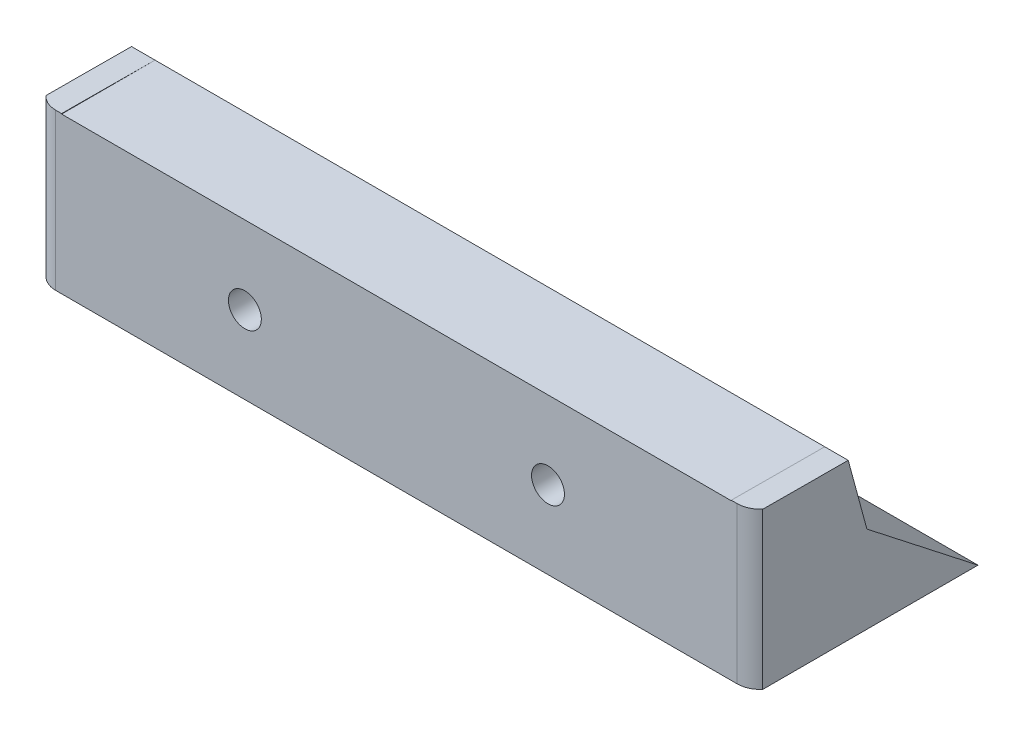
ISO-10303-21;
HEADER;
FILE_DESCRIPTION(('STEP AP214'),'2;1');
FILE_NAME('part.step','',(''),(''),'','','');
FILE_SCHEMA(('AUTOMOTIVE_DESIGN { 1 0 10303 214 1 1 1 1 }'));
ENDSEC;
DATA;
#1=APPLICATION_CONTEXT('core data for automotive mechanical design processes');
#2=APPLICATION_PROTOCOL_DEFINITION('international standard','automotive_design',2000,#1);
#3=PRODUCT_CONTEXT('',#1,'mechanical');
#4=PRODUCT('Part','Part','',(#3));
#5=PRODUCT_RELATED_PRODUCT_CATEGORY('part','',(#4));
#6=PRODUCT_DEFINITION_FORMATION('','',#4);
#7=PRODUCT_DEFINITION_CONTEXT('part definition',#1,'design');
#8=PRODUCT_DEFINITION('design','',#6,#7);
#9=PRODUCT_DEFINITION_SHAPE('','',#8);
#10=(LENGTH_UNIT() NAMED_UNIT(*) SI_UNIT(.MILLI.,.METRE.));
#11=(NAMED_UNIT(*) PLANE_ANGLE_UNIT() SI_UNIT($,.RADIAN.));
#12=(NAMED_UNIT(*) SI_UNIT($,.STERADIAN.) SOLID_ANGLE_UNIT());
#13=UNCERTAINTY_MEASURE_WITH_UNIT(LENGTH_MEASURE(1.E-05),#10,'distance_accuracy_value','');
#14=(GEOMETRIC_REPRESENTATION_CONTEXT(3) GLOBAL_UNCERTAINTY_ASSIGNED_CONTEXT((#13)) GLOBAL_UNIT_ASSIGNED_CONTEXT((#10,
#11,#12)) REPRESENTATION_CONTEXT('',''));
#15=CARTESIAN_POINT('',(0.,0.,0.));
#16=DIRECTION('',(0.,0.,1.));
#17=DIRECTION('',(1.,0.,0.));
#18=AXIS2_PLACEMENT_3D('',#15,#16,#17);
#19=CARTESIAN_POINT('',(31.,-21.,1.45));
#20=DIRECTION('',(0.,1.,0.));
#21=DIRECTION('',(0.,0.,1.));
#22=AXIS2_PLACEMENT_3D('',#19,#20,#21);
#23=PLANE('',#22);
#24=DIRECTION('',(0.,0.,-1.));
#25=VECTOR('',#24,1.);
#26=CARTESIAN_POINT('',(30.5,-21.,21.55));
#27=LINE('',#26,#25);
#28=CARTESIAN_POINT('',(30.5,-21.,0.772875655532291));
#29=VERTEX_POINT('',#28);
#30=CARTESIAN_POINT('',(30.5,-21.,-17.55));
#31=VERTEX_POINT('',#30);
#32=EDGE_CURVE('E111',#29,#31,#27,.T.);
#33=ORIENTED_EDGE('',*,*,#32,.F.);
#34=CARTESIAN_POINT('',(29.,-21.,-0.550000000000002));
#35=DIRECTION('',(0.,1.,0.));
#36=DIRECTION('',(0.,0.,1.));
#37=AXIS2_PLACEMENT_3D('',#34,#35,#36);
#38=CIRCLE('',#37,2.);
#39=CARTESIAN_POINT('',(29.,-21.,1.45));
#40=VERTEX_POINT('',#39);
#41=EDGE_CURVE('E121',#29,#40,#38,.F.);
#42=ORIENTED_EDGE('',*,*,#41,.T.);
#43=DIRECTION('',(-1.,0.,0.));
#44=VECTOR('',#43,1.);
#45=CARTESIAN_POINT('',(31.,-21.,1.45));
#46=LINE('',#45,#44);
#47=CARTESIAN_POINT('',(-29.,-21.,1.45));
#48=VERTEX_POINT('',#47);
#49=EDGE_CURVE('E153',#40,#48,#46,.T.);
#50=ORIENTED_EDGE('',*,*,#49,.T.);
#51=CARTESIAN_POINT('',(-29.,-21.,-0.550000000000002));
#52=DIRECTION('',(0.,1.,0.));
#53=DIRECTION('',(0.,0.,1.));
#54=AXIS2_PLACEMENT_3D('',#51,#52,#53);
#55=CIRCLE('',#54,2.);
#56=CARTESIAN_POINT('',(-30.5,-21.,0.772875655532284));
#57=VERTEX_POINT('',#56);
#58=EDGE_CURVE('E128',#48,#57,#55,.F.);
#59=ORIENTED_EDGE('',*,*,#58,.T.);
#60=DIRECTION('',(0.,0.,1.));
#61=VECTOR('',#60,1.);
#62=CARTESIAN_POINT('',(-30.5,-21.,21.55));
#63=LINE('',#62,#61);
#64=CARTESIAN_POINT('',(-30.5,-21.,-17.55));
#65=VERTEX_POINT('',#64);
#66=EDGE_CURVE('E51',#65,#57,#63,.T.);
#67=ORIENTED_EDGE('',*,*,#66,.F.);
#68=DIRECTION('',(-1.,0.,0.));
#69=VECTOR('',#68,1.);
#70=CARTESIAN_POINT('',(31.,-21.,-17.55));
#71=LINE('',#70,#69);
#72=EDGE_CURVE('E124',#31,#65,#71,.T.);
#73=ORIENTED_EDGE('',*,*,#72,.F.);
#74=EDGE_LOOP('',(#33,#42,#50,#59,#67,#73));
#75=FACE_BOUND('',#74,.T.);
#76=ADVANCED_FACE('F36',(#75),#23,.F.);
#77=CARTESIAN_POINT('',(31.,-21.,-17.55));
#78=DIRECTION('',(0.,-0.788010753606726,0.615661475325653));
#79=DIRECTION('',(0.,-0.615661475325653,-0.788010753606726));
#80=AXIS2_PLACEMENT_3D('',#77,#78,#79);
#81=PLANE('',#80);
#82=DIRECTION('',(0.,0.615661475325653,0.788010753606726));
#83=VECTOR('',#82,1.);
#84=CARTESIAN_POINT('',(30.5,-21.,-17.55));
#85=LINE('',#84,#83);
#86=CARTESIAN_POINT('',(30.5,-13.6120622960922,-8.09387095671929));
#87=VERTEX_POINT('',#86);
#88=EDGE_CURVE('E205',#31,#87,#85,.T.);
#89=ORIENTED_EDGE('',*,*,#88,.F.);
#90=ORIENTED_EDGE('',*,*,#72,.T.);
#91=DIRECTION('',(0.,-0.615661475325653,-0.788010753606726));
#92=VECTOR('',#91,1.);
#93=CARTESIAN_POINT('',(-30.5,-21.,-17.55));
#94=LINE('',#93,#92);
#95=CARTESIAN_POINT('',(-30.5,-13.6120622960922,-8.09387095671929));
#96=VERTEX_POINT('',#95);
#97=EDGE_CURVE('E207',#96,#65,#94,.T.);
#98=ORIENTED_EDGE('',*,*,#97,.F.);
#99=DIRECTION('',(-1.,0.,0.));
#100=VECTOR('',#99,1.);
#101=CARTESIAN_POINT('',(31.,-13.6120622960922,-8.09387095671929));
#102=LINE('',#101,#100);
#103=EDGE_CURVE('E185',#87,#96,#102,.T.);
#104=ORIENTED_EDGE('',*,*,#103,.F.);
#105=EDGE_LOOP('',(#89,#90,#98,#104));
#106=FACE_BOUND('',#105,.T.);
#107=ADVANCED_FACE('F246',(#106),#81,.F.);
#108=CARTESIAN_POINT('',(31.,-13.6120622960922,-8.09387095671929));
#109=DIRECTION('',(0.,-0.261669438560527,0.965157554455965));
#110=DIRECTION('',(0.,-0.965157554455965,-0.261669438560527));
#111=AXIS2_PLACEMENT_3D('',#108,#109,#110);
#112=PLANE('',#111);
#113=DIRECTION('',(0.,0.965157554455965,0.261669438560527));
#114=VECTOR('',#113,1.);
#115=CARTESIAN_POINT('',(30.5,-13.6120622960922,-8.09387095671929));
#116=LINE('',#115,#114);
#117=CARTESIAN_POINT('',(30.5,-7.75,-6.50457339307964));
#118=VERTEX_POINT('',#117);
#119=EDGE_CURVE('E209',#87,#118,#116,.T.);
#120=ORIENTED_EDGE('',*,*,#119,.F.);
#121=ORIENTED_EDGE('',*,*,#103,.T.);
#122=DIRECTION('',(0.,-0.965157554455965,-0.261669438560527));
#123=VECTOR('',#122,1.);
#124=CARTESIAN_POINT('',(-30.5,-13.6120622960922,-8.09387095671929));
#125=LINE('',#124,#123);
#126=CARTESIAN_POINT('',(-30.5,-7.75,-6.50457339307964));
#127=VERTEX_POINT('',#126);
#128=EDGE_CURVE('E204',#127,#96,#125,.T.);
#129=ORIENTED_EDGE('',*,*,#128,.F.);
#130=DIRECTION('',(1.,0.,0.));
#131=VECTOR('',#130,1.);
#132=CARTESIAN_POINT('',(-31.,-7.75,-6.50457339307964));
#133=LINE('',#132,#131);
#134=CARTESIAN_POINT('',(-28.5,-7.75,-6.50457339307964));
#135=VERTEX_POINT('',#134);
#136=EDGE_CURVE('E203',#127,#135,#133,.T.);
#137=ORIENTED_EDGE('',*,*,#136,.T.);
#138=DIRECTION('',(-1.,0.,0.));
#139=VECTOR('',#138,1.);
#140=CARTESIAN_POINT('',(-28.5,-7.75,-6.50457339307964));
#141=LINE('',#140,#139);
#142=CARTESIAN_POINT('',(28.5,-7.75,-6.50457339307964));
#143=VERTEX_POINT('',#142);
#144=EDGE_CURVE('E178',#143,#135,#141,.T.);
#145=ORIENTED_EDGE('',*,*,#144,.F.);
#146=EDGE_CURVE('E214',#143,#118,#133,.T.);
#147=ORIENTED_EDGE('',*,*,#146,.T.);
#148=EDGE_LOOP('',(#120,#121,#129,#137,#145,#147));
#149=FACE_BOUND('',#148,.T.);
#150=ADVANCED_FACE('F250',(#149),#112,.F.);
#151=CARTESIAN_POINT('',(-31.,-7.71124143049908,1.45));
#152=DIRECTION('',(0.,-0.999988129637971,0.00487243092840016));
#153=DIRECTION('',(0.,-0.00487243092840016,-0.999988129637971));
#154=AXIS2_PLACEMENT_3D('',#151,#152,#153);
#155=PLANE('',#154);
#156=DIRECTION('',(0.,0.00487243092840017,0.999988129637971));
#157=VECTOR('',#156,1.);
#158=CARTESIAN_POINT('',(30.5,-7.71124143049908,1.45));
#159=LINE('',#158,#157);
#160=CARTESIAN_POINT('',(30.5,-7.71454071126109,0.772875655532293));
#161=VERTEX_POINT('',#160);
#162=EDGE_CURVE('E58',#118,#161,#159,.T.);
#163=ORIENTED_EDGE('',*,*,#162,.F.);
#164=ORIENTED_EDGE('',*,*,#146,.F.);
#165=DIRECTION('',(0.,-0.00487243092840016,-0.999988129637971));
#166=VECTOR('',#165,1.);
#167=CARTESIAN_POINT('',(28.5,-7.80353742475213,-17.4922692743));
#168=LINE('',#167,#166);
#169=CARTESIAN_POINT('',(28.5,-7.71124143049908,1.45));
#170=VERTEX_POINT('',#169);
#171=EDGE_CURVE('E146',#170,#143,#168,.T.);
#172=ORIENTED_EDGE('',*,*,#171,.F.);
#173=DIRECTION('',(-1.,0.,0.));
#174=VECTOR('',#173,1.);
#175=CARTESIAN_POINT('',(31.,-7.71124143049908,1.45));
#176=LINE('',#175,#174);
#177=CARTESIAN_POINT('',(29.,-7.71124143049908,1.45));
#178=VERTEX_POINT('',#177);
#179=EDGE_CURVE('E144',#178,#170,#176,.T.);
#180=ORIENTED_EDGE('',*,*,#179,.F.);
#181=CARTESIAN_POINT('',(29.,-7.72098640803229,-0.550000000000001));
#182=DIRECTION('',(0.,-0.999988129637971,0.00487243092840016));
#183=DIRECTION('',(0.,0.00487243092840016,0.999988129637971));
#184=AXIS2_PLACEMENT_3D('',#181,#182,#183);
#185=ELLIPSE('',#184,2.00002374100587,2.);
#186=EDGE_CURVE('E117',#178,#161,#185,.F.);
#187=ORIENTED_EDGE('',*,*,#186,.T.);
#188=EDGE_LOOP('',(#163,#164,#172,#180,#187));
#189=FACE_BOUND('',#188,.T.);
#190=ADVANCED_FACE('F141',(#189),#155,.F.);
#191=DIRECTION('',(0.,-0.00487243092840017,-0.999988129637971));
#192=VECTOR('',#191,1.);
#193=CARTESIAN_POINT('',(-30.5,-7.71124143049908,1.45));
#194=LINE('',#193,#192);
#195=CARTESIAN_POINT('',(-30.5,-7.71454071126109,0.772875655532285));
#196=VERTEX_POINT('',#195);
#197=EDGE_CURVE('E197',#196,#127,#194,.T.);
#198=ORIENTED_EDGE('',*,*,#197,.F.);
#199=CARTESIAN_POINT('',(-29.,-7.72098640803229,-0.550000000000001));
#200=DIRECTION('',(0.,-0.999988129637971,0.00487243092840016));
#201=DIRECTION('',(0.,-0.00487243092840016,-0.999988129637971));
#202=AXIS2_PLACEMENT_3D('',#199,#200,#201);
#203=ELLIPSE('',#202,2.00002374100587,2.);
#204=CARTESIAN_POINT('',(-29.,-7.71124143049908,1.45));
#205=VERTEX_POINT('',#204);
#206=EDGE_CURVE('E132',#196,#205,#203,.F.);
#207=ORIENTED_EDGE('',*,*,#206,.T.);
#208=CARTESIAN_POINT('',(-28.5,-7.71124143049908,1.45));
#209=VERTEX_POINT('',#208);
#210=EDGE_CURVE('E150',#209,#205,#176,.T.);
#211=ORIENTED_EDGE('',*,*,#210,.F.);
#212=DIRECTION('',(0.,0.00487243092840016,0.999988129637971));
#213=VECTOR('',#212,1.);
#214=CARTESIAN_POINT('',(-28.5,-7.80353742475213,-17.4922692743));
#215=LINE('',#214,#213);
#216=EDGE_CURVE('E217',#135,#209,#215,.T.);
#217=ORIENTED_EDGE('',*,*,#216,.F.);
#218=ORIENTED_EDGE('',*,*,#136,.F.);
#219=EDGE_LOOP('',(#198,#207,#211,#217,#218));
#220=FACE_BOUND('',#219,.T.);
#221=ADVANCED_FACE('F201',(#220),#155,.F.);
#222=CARTESIAN_POINT('',(-29.,-7.71124143049908,-0.550000000000001));
#223=DIRECTION('',(0.,-1.,0.));
#224=DIRECTION('',(0.,0.,-1.));
#225=AXIS2_PLACEMENT_3D('',#222,#223,#224);
#226=CYLINDRICAL_SURFACE('',#225,2.);
#227=ORIENTED_EDGE('',*,*,#206,.F.);
#228=DIRECTION('',(0.,-1.,0.));
#229=VECTOR('',#228,1.);
#230=CARTESIAN_POINT('',(-30.5,-7.71124143049908,0.772875655532285));
#231=LINE('',#230,#229);
#232=EDGE_CURVE('E11',#196,#57,#231,.T.);
#233=ORIENTED_EDGE('',*,*,#232,.T.);
#234=ORIENTED_EDGE('',*,*,#58,.F.);
#235=DIRECTION('',(0.,-1.,0.));
#236=VECTOR('',#235,1.);
#237=CARTESIAN_POINT('',(-29.,-7.71124143049908,1.45));
#238=LINE('',#237,#236);
#239=EDGE_CURVE('E129',#205,#48,#238,.T.);
#240=ORIENTED_EDGE('',*,*,#239,.F.);
#241=EDGE_LOOP('',(#227,#233,#234,#240));
#242=FACE_BOUND('',#241,.T.);
#243=ADVANCED_FACE('F194',(#242),#226,.T.);
#244=CARTESIAN_POINT('',(29.,0.,-0.55));
#245=DIRECTION('',(0.,1.,0.));
#246=DIRECTION('',(0.,0.,1.));
#247=AXIS2_PLACEMENT_3D('',#244,#245,#246);
#248=CYLINDRICAL_SURFACE('',#247,2.);
#249=ORIENTED_EDGE('',*,*,#41,.F.);
#250=DIRECTION('',(0.,1.,0.));
#251=VECTOR('',#250,1.);
#252=CARTESIAN_POINT('',(30.5,0.,0.772875655532294));
#253=LINE('',#252,#251);
#254=EDGE_CURVE('E44',#29,#161,#253,.T.);
#255=ORIENTED_EDGE('',*,*,#254,.T.);
#256=ORIENTED_EDGE('',*,*,#186,.F.);
#257=DIRECTION('',(0.,-1.,0.));
#258=VECTOR('',#257,1.);
#259=CARTESIAN_POINT('',(29.,-7.71124143049908,1.45));
#260=LINE('',#259,#258);
#261=EDGE_CURVE('E127',#40,#178,#260,.F.);
#262=ORIENTED_EDGE('',*,*,#261,.F.);
#263=EDGE_LOOP('',(#249,#255,#256,#262));
#264=FACE_BOUND('',#263,.T.);
#265=ADVANCED_FACE('F38',(#264),#248,.T.);
#266=CARTESIAN_POINT('',(31.,-7.71124143049908,1.45));
#267=DIRECTION('',(0.,0.,-1.));
#268=DIRECTION('',(0.,1.,0.));
#269=AXIS2_PLACEMENT_3D('',#266,#267,#268);
#270=PLANE('',#269);
#271=CARTESIAN_POINT('',(-12.9,-14.375,1.45));
#272=DIRECTION('',(0.,0.,-1.));
#273=DIRECTION('',(0.,1.,0.));
#274=AXIS2_PLACEMENT_3D('',#271,#272,#273);
#275=CIRCLE('',#274,1.4);
#276=CARTESIAN_POINT('',(-12.9,-12.975,1.45));
#277=VERTEX_POINT('',#276);
#278=EDGE_CURVE('E160',#277,#277,#275,.T.);
#279=ORIENTED_EDGE('',*,*,#278,.T.);
#280=EDGE_LOOP('',(#279));
#281=FACE_BOUND('',#280,.T.);
#282=CARTESIAN_POINT('',(12.9,-14.375,1.45));
#283=DIRECTION('',(0.,0.,-1.));
#284=DIRECTION('',(0.,1.,0.));
#285=AXIS2_PLACEMENT_3D('',#282,#283,#284);
#286=CIRCLE('',#285,1.4);
#287=CARTESIAN_POINT('',(12.9,-12.975,1.45));
#288=VERTEX_POINT('',#287);
#289=EDGE_CURVE('E157',#288,#288,#286,.T.);
#290=ORIENTED_EDGE('',*,*,#289,.T.);
#291=EDGE_LOOP('',(#290));
#292=FACE_BOUND('',#291,.T.);
#293=ORIENTED_EDGE('',*,*,#210,.T.);
#294=ORIENTED_EDGE('',*,*,#239,.T.);
#295=ORIENTED_EDGE('',*,*,#49,.F.);
#296=ORIENTED_EDGE('',*,*,#261,.T.);
#297=ORIENTED_EDGE('',*,*,#179,.T.);
#298=DIRECTION('',(0.,1.,0.));
#299=VECTOR('',#298,1.);
#300=CARTESIAN_POINT('',(28.5,4.25,1.45));
#301=LINE('',#300,#299);
#302=CARTESIAN_POINT('',(28.5,-7.75,1.45));
#303=VERTEX_POINT('',#302);
#304=EDGE_CURVE('E163',#303,#170,#301,.T.);
#305=ORIENTED_EDGE('',*,*,#304,.F.);
#306=DIRECTION('',(1.,0.,0.));
#307=VECTOR('',#306,1.);
#308=CARTESIAN_POINT('',(-28.5,-7.75,1.45));
#309=LINE('',#308,#307);
#310=CARTESIAN_POINT('',(-28.5,-7.75,1.45));
#311=VERTEX_POINT('',#310);
#312=EDGE_CURVE('E183',#311,#303,#309,.T.);
#313=ORIENTED_EDGE('',*,*,#312,.F.);
#314=DIRECTION('',(0.,-1.,0.));
#315=VECTOR('',#314,1.);
#316=CARTESIAN_POINT('',(-28.5,4.25,1.45));
#317=LINE('',#316,#315);
#318=EDGE_CURVE('E166',#209,#311,#317,.T.);
#319=ORIENTED_EDGE('',*,*,#318,.F.);
#320=EDGE_LOOP('',(#293,#294,#295,#296,#297,#305,#313,#319));
#321=FACE_BOUND('',#320,.T.);
#322=ADVANCED_FACE('F189',(#281,#292,#321),#270,.F.);
#323=CARTESIAN_POINT('',(-28.5,4.25,-17.551));
#324=DIRECTION('',(-1.,0.,0.));
#325=DIRECTION('',(0.,-1.,0.));
#326=AXIS2_PLACEMENT_3D('',#323,#324,#325);
#327=PLANE('',#326);
#328=DIRECTION('',(0.,0.,1.));
#329=VECTOR('',#328,1.);
#330=CARTESIAN_POINT('',(-28.5,-7.75,-17.551));
#331=LINE('',#330,#329);
#332=EDGE_CURVE('E170',#135,#311,#331,.T.);
#333=ORIENTED_EDGE('',*,*,#332,.F.);
#334=ORIENTED_EDGE('',*,*,#216,.T.);
#335=ORIENTED_EDGE('',*,*,#318,.T.);
#336=EDGE_LOOP('',(#333,#334,#335));
#337=FACE_BOUND('',#336,.T.);
#338=ADVANCED_FACE('F235',(#337),#327,.F.);
#339=CARTESIAN_POINT('',(28.5,4.25,-17.551));
#340=DIRECTION('',(1.,0.,0.));
#341=DIRECTION('',(0.,0.,-1.));
#342=AXIS2_PLACEMENT_3D('',#339,#340,#341);
#343=PLANE('',#342);
#344=ORIENTED_EDGE('',*,*,#304,.T.);
#345=ORIENTED_EDGE('',*,*,#171,.T.);
#346=DIRECTION('',(0.,0.,1.));
#347=VECTOR('',#346,1.);
#348=CARTESIAN_POINT('',(28.5,-7.75,-17.551));
#349=LINE('',#348,#347);
#350=EDGE_CURVE('E176',#143,#303,#349,.T.);
#351=ORIENTED_EDGE('',*,*,#350,.T.);
#352=EDGE_LOOP('',(#344,#345,#351));
#353=FACE_BOUND('',#352,.T.);
#354=ADVANCED_FACE('F241',(#353),#343,.F.);
#355=CARTESIAN_POINT('',(-28.5,-7.75,-17.551));
#356=DIRECTION('',(0.,-1.,0.));
#357=DIRECTION('',(1.,0.,0.));
#358=AXIS2_PLACEMENT_3D('',#355,#356,#357);
#359=PLANE('',#358);
#360=ORIENTED_EDGE('',*,*,#312,.T.);
#361=ORIENTED_EDGE('',*,*,#350,.F.);
#362=ORIENTED_EDGE('',*,*,#144,.T.);
#363=ORIENTED_EDGE('',*,*,#332,.T.);
#364=EDGE_LOOP('',(#360,#361,#362,#363));
#365=FACE_BOUND('',#364,.T.);
#366=ADVANCED_FACE('F230',(#365),#359,.F.);
#367=CARTESIAN_POINT('',(12.9,-14.375,-4.75));
#368=DIRECTION('',(0.,0.,1.));
#369=DIRECTION('',(1.,0.,0.));
#370=AXIS2_PLACEMENT_3D('',#367,#368,#369);
#371=CYLINDRICAL_SURFACE('',#370,1.4);
#372=CARTESIAN_POINT('',(12.9,-14.375,-4.75));
#373=DIRECTION('',(0.,0.,1.));
#374=DIRECTION('',(-1.,0.,0.));
#375=AXIS2_PLACEMENT_3D('',#372,#373,#374);
#376=CIRCLE('',#375,1.4);
#377=CARTESIAN_POINT('',(11.5,-14.375,-4.75));
#378=VERTEX_POINT('',#377);
#379=EDGE_CURVE('E173',#378,#378,#376,.T.);
#380=ORIENTED_EDGE('',*,*,#379,.F.);
#381=EDGE_LOOP('',(#380));
#382=FACE_BOUND('',#381,.T.);
#383=ORIENTED_EDGE('',*,*,#289,.F.);
#384=EDGE_LOOP('',(#383));
#385=FACE_BOUND('',#384,.T.);
#386=ADVANCED_FACE('F227',(#382,#385),#371,.F.);
#387=CARTESIAN_POINT('',(12.9,-14.375,-4.75));
#388=DIRECTION('',(0.,0.,-1.));
#389=DIRECTION('',(-1.,0.,0.));
#390=AXIS2_PLACEMENT_3D('',#387,#388,#389);
#391=PLANE('',#390);
#392=ORIENTED_EDGE('',*,*,#379,.T.);
#393=EDGE_LOOP('',(#392));
#394=FACE_BOUND('',#393,.T.);
#395=ADVANCED_FACE('F225',(#394),#391,.F.);
#396=CARTESIAN_POINT('',(-12.9,-14.375,-4.75));
#397=DIRECTION('',(0.,0.,1.));
#398=DIRECTION('',(1.,0.,0.));
#399=AXIS2_PLACEMENT_3D('',#396,#397,#398);
#400=CYLINDRICAL_SURFACE('',#399,1.4);
#401=CARTESIAN_POINT('',(-12.9,-14.375,-4.75));
#402=DIRECTION('',(0.,0.,1.));
#403=DIRECTION('',(1.,0.,0.));
#404=AXIS2_PLACEMENT_3D('',#401,#402,#403);
#405=CIRCLE('',#404,1.4);
#406=CARTESIAN_POINT('',(-11.5,-14.375,-4.75));
#407=VERTEX_POINT('',#406);
#408=EDGE_CURVE('E161',#407,#407,#405,.T.);
#409=ORIENTED_EDGE('',*,*,#408,.F.);
#410=EDGE_LOOP('',(#409));
#411=FACE_BOUND('',#410,.T.);
#412=ORIENTED_EDGE('',*,*,#278,.F.);
#413=EDGE_LOOP('',(#412));
#414=FACE_BOUND('',#413,.T.);
#415=ADVANCED_FACE('F263',(#411,#414),#400,.F.);
#416=CARTESIAN_POINT('',(-12.9,-14.375,-4.75));
#417=DIRECTION('',(0.,0.,1.));
#418=DIRECTION('',(1.,0.,0.));
#419=AXIS2_PLACEMENT_3D('',#416,#417,#418);
#420=PLANE('',#419);
#421=ORIENTED_EDGE('',*,*,#408,.T.);
#422=EDGE_LOOP('',(#421));
#423=FACE_BOUND('',#422,.T.);
#424=ADVANCED_FACE('F266',(#423),#420,.T.);
#425=CARTESIAN_POINT('',(30.5,-21.,21.55));
#426=DIRECTION('',(1.,0.,0.));
#427=DIRECTION('',(0.,1.,0.));
#428=AXIS2_PLACEMENT_3D('',#425,#426,#427);
#429=PLANE('',#428);
#430=ORIENTED_EDGE('',*,*,#88,.T.);
#431=ORIENTED_EDGE('',*,*,#119,.T.);
#432=ORIENTED_EDGE('',*,*,#162,.T.);
#433=ORIENTED_EDGE('',*,*,#254,.F.);
#434=ORIENTED_EDGE('',*,*,#32,.T.);
#435=EDGE_LOOP('',(#430,#431,#432,#433,#434));
#436=FACE_BOUND('',#435,.T.);
#437=ADVANCED_FACE('F110',(#436),#429,.T.);
#438=CARTESIAN_POINT('',(-30.5,-21.,21.55));
#439=DIRECTION('',(-1.,0.,0.));
#440=DIRECTION('',(0.,-1.,0.));
#441=AXIS2_PLACEMENT_3D('',#438,#439,#440);
#442=PLANE('',#441);
#443=ORIENTED_EDGE('',*,*,#97,.T.);
#444=ORIENTED_EDGE('',*,*,#66,.T.);
#445=ORIENTED_EDGE('',*,*,#232,.F.);
#446=ORIENTED_EDGE('',*,*,#197,.T.);
#447=ORIENTED_EDGE('',*,*,#128,.T.);
#448=EDGE_LOOP('',(#443,#444,#445,#446,#447));
#449=FACE_BOUND('',#448,.T.);
#450=ADVANCED_FACE('F196',(#449),#442,.T.);
#451=CLOSED_SHELL('',(#76,#107,#150,#190,#221,#243,#265,#322,#338,#354,#366,#386,#395,#415,#424,
#437,#450));
#452=MANIFOLD_SOLID_BREP('B2',#451);
#453=ADVANCED_BREP_SHAPE_REPRESENTATION('',(#18,#452),#14);
#454=SHAPE_DEFINITION_REPRESENTATION(#9,#453);
ENDSEC;
END-ISO-10303-21;
